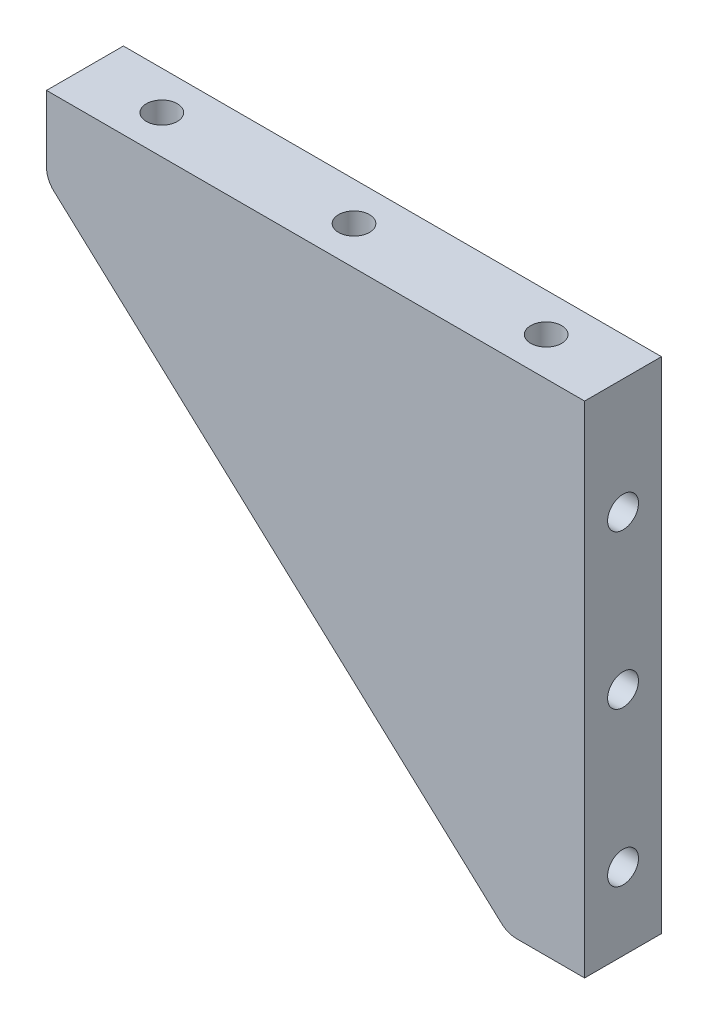
ISO-10303-21;
HEADER;
FILE_DESCRIPTION(('STEP AP214'),'2;1');
FILE_NAME('part.step','',(''),(''),'','','');
FILE_SCHEMA(('AUTOMOTIVE_DESIGN { 1 0 10303 214 1 1 1 1 }'));
ENDSEC;
DATA;
#1=APPLICATION_CONTEXT('core data for automotive mechanical design processes');
#2=APPLICATION_PROTOCOL_DEFINITION('international standard','automotive_design',2000,#1);
#3=PRODUCT_CONTEXT('',#1,'mechanical');
#4=PRODUCT('Part','Part','',(#3));
#5=PRODUCT_RELATED_PRODUCT_CATEGORY('part','',(#4));
#6=PRODUCT_DEFINITION_FORMATION('','',#4);
#7=PRODUCT_DEFINITION_CONTEXT('part definition',#1,'design');
#8=PRODUCT_DEFINITION('design','',#6,#7);
#9=PRODUCT_DEFINITION_SHAPE('','',#8);
#10=(LENGTH_UNIT() NAMED_UNIT(*) SI_UNIT(.MILLI.,.METRE.));
#11=(NAMED_UNIT(*) PLANE_ANGLE_UNIT() SI_UNIT($,.RADIAN.));
#12=(NAMED_UNIT(*) SI_UNIT($,.STERADIAN.) SOLID_ANGLE_UNIT());
#13=UNCERTAINTY_MEASURE_WITH_UNIT(LENGTH_MEASURE(1.E-05),#10,'distance_accuracy_value','');
#14=(GEOMETRIC_REPRESENTATION_CONTEXT(3) GLOBAL_UNCERTAINTY_ASSIGNED_CONTEXT((#13)) GLOBAL_UNIT_ASSIGNED_CONTEXT((#10,
#11,#12)) REPRESENTATION_CONTEXT('',''));
#15=CARTESIAN_POINT('',(0.,0.,0.));
#16=DIRECTION('',(0.,0.,1.));
#17=DIRECTION('',(1.,0.,0.));
#18=AXIS2_PLACEMENT_3D('',#15,#16,#17);
#19=CARTESIAN_POINT('',(0.,-82.55,6.35));
#20=DIRECTION('',(-1.,0.,0.));
#21=DIRECTION('',(0.,0.,1.));
#22=AXIS2_PLACEMENT_3D('',#19,#20,#21);
#23=PLANE('',#22);
#24=CARTESIAN_POINT('',(0.,-19.05,0.));
#25=DIRECTION('',(1.,0.,0.));
#26=DIRECTION('',(0.,0.,-1.));
#27=AXIS2_PLACEMENT_3D('',#24,#25,#26);
#28=CIRCLE('',#27,2.55269999999999);
#29=CARTESIAN_POINT('',(0.,-19.05,-2.55269999999999));
#30=VERTEX_POINT('',#29);
#31=EDGE_CURVE('E130',#30,#30,#28,.T.);
#32=ORIENTED_EDGE('',*,*,#31,.F.);
#33=EDGE_LOOP('',(#32));
#34=FACE_BOUND('',#33,.T.);
#35=CARTESIAN_POINT('',(0.,-44.45,0.));
#36=DIRECTION('',(1.,0.,0.));
#37=DIRECTION('',(0.,0.,-1.));
#38=AXIS2_PLACEMENT_3D('',#35,#36,#37);
#39=CIRCLE('',#38,2.55269999999999);
#40=CARTESIAN_POINT('',(0.,-44.45,-2.55269999999999));
#41=VERTEX_POINT('',#40);
#42=EDGE_CURVE('E129',#41,#41,#39,.T.);
#43=ORIENTED_EDGE('',*,*,#42,.F.);
#44=EDGE_LOOP('',(#43));
#45=FACE_BOUND('',#44,.T.);
#46=CARTESIAN_POINT('',(0.,-69.85,0.));
#47=DIRECTION('',(1.,0.,0.));
#48=DIRECTION('',(0.,0.,-1.));
#49=AXIS2_PLACEMENT_3D('',#46,#47,#48);
#50=CIRCLE('',#49,2.55269999999999);
#51=CARTESIAN_POINT('',(0.,-69.85,-2.55269999999999));
#52=VERTEX_POINT('',#51);
#53=EDGE_CURVE('E140',#52,#52,#50,.T.);
#54=ORIENTED_EDGE('',*,*,#53,.F.);
#55=EDGE_LOOP('',(#54));
#56=FACE_BOUND('',#55,.T.);
#57=DIRECTION('',(0.,1.,0.));
#58=VECTOR('',#57,1.);
#59=CARTESIAN_POINT('',(0.,-82.55,-6.35));
#60=LINE('',#59,#58);
#61=CARTESIAN_POINT('',(0.,-82.55,-6.35));
#62=VERTEX_POINT('',#61);
#63=CARTESIAN_POINT('',(0.,0.,-6.35));
#64=VERTEX_POINT('',#63);
#65=EDGE_CURVE('E164',#62,#64,#60,.T.);
#66=ORIENTED_EDGE('',*,*,#65,.T.);
#67=DIRECTION('',(0.,0.,-1.));
#68=VECTOR('',#67,1.);
#69=CARTESIAN_POINT('',(0.,0.,6.35));
#70=LINE('',#69,#68);
#71=CARTESIAN_POINT('',(0.,0.,6.35));
#72=VERTEX_POINT('',#71);
#73=EDGE_CURVE('E193',#72,#64,#70,.T.);
#74=ORIENTED_EDGE('',*,*,#73,.F.);
#75=DIRECTION('',(0.,1.,0.));
#76=VECTOR('',#75,1.);
#77=CARTESIAN_POINT('',(0.,-82.55,6.35));
#78=LINE('',#77,#76);
#79=CARTESIAN_POINT('',(0.,-82.55,6.35));
#80=VERTEX_POINT('',#79);
#81=EDGE_CURVE('E165',#80,#72,#78,.T.);
#82=ORIENTED_EDGE('',*,*,#81,.F.);
#83=DIRECTION('',(0.,0.,-1.));
#84=VECTOR('',#83,1.);
#85=CARTESIAN_POINT('',(0.,-82.55,6.35));
#86=LINE('',#85,#84);
#87=EDGE_CURVE('E177',#80,#62,#86,.T.);
#88=ORIENTED_EDGE('',*,*,#87,.T.);
#89=EDGE_LOOP('',(#66,#74,#82,#88));
#90=FACE_BOUND('',#89,.T.);
#91=ADVANCED_FACE('F41',(#34,#45,#56,#90),#23,.F.);
#92=CARTESIAN_POINT('',(0.,0.,6.35));
#93=DIRECTION('',(0.,-1.,0.));
#94=DIRECTION('',(1.,0.,0.));
#95=AXIS2_PLACEMENT_3D('',#92,#93,#94);
#96=PLANE('',#95);
#97=CARTESIAN_POINT('',(-12.7,0.,0.));
#98=DIRECTION('',(0.,1.,0.));
#99=DIRECTION('',(0.,0.,1.));
#100=AXIS2_PLACEMENT_3D('',#97,#98,#99);
#101=CIRCLE('',#100,2.5527);
#102=CARTESIAN_POINT('',(-12.7,0.,2.5527));
#103=VERTEX_POINT('',#102);
#104=EDGE_CURVE('E146',#103,#103,#101,.T.);
#105=ORIENTED_EDGE('',*,*,#104,.F.);
#106=EDGE_LOOP('',(#105));
#107=FACE_BOUND('',#106,.T.);
#108=CARTESIAN_POINT('',(-44.45,0.,0.));
#109=DIRECTION('',(0.,1.,0.));
#110=DIRECTION('',(0.,0.,1.));
#111=AXIS2_PLACEMENT_3D('',#108,#109,#110);
#112=CIRCLE('',#111,2.5527);
#113=CARTESIAN_POINT('',(-44.45,0.,2.5527));
#114=VERTEX_POINT('',#113);
#115=EDGE_CURVE('E152',#114,#114,#112,.T.);
#116=ORIENTED_EDGE('',*,*,#115,.F.);
#117=EDGE_LOOP('',(#116));
#118=FACE_BOUND('',#117,.T.);
#119=CARTESIAN_POINT('',(-76.2,0.,0.));
#120=DIRECTION('',(0.,1.,0.));
#121=DIRECTION('',(0.,0.,1.));
#122=AXIS2_PLACEMENT_3D('',#119,#120,#121);
#123=CIRCLE('',#122,2.55270000000001);
#124=CARTESIAN_POINT('',(-76.2,0.,2.55270000000001));
#125=VERTEX_POINT('',#124);
#126=EDGE_CURVE('E158',#125,#125,#123,.T.);
#127=ORIENTED_EDGE('',*,*,#126,.F.);
#128=EDGE_LOOP('',(#127));
#129=FACE_BOUND('',#128,.T.);
#130=DIRECTION('',(-1.,0.,0.));
#131=VECTOR('',#130,1.);
#132=CARTESIAN_POINT('',(0.,0.,-6.35));
#133=LINE('',#132,#131);
#134=CARTESIAN_POINT('',(-88.9,0.,-6.35));
#135=VERTEX_POINT('',#134);
#136=EDGE_CURVE('E180',#64,#135,#133,.T.);
#137=ORIENTED_EDGE('',*,*,#136,.T.);
#138=DIRECTION('',(0.,0.,-1.));
#139=VECTOR('',#138,1.);
#140=CARTESIAN_POINT('',(-88.9,0.,6.35));
#141=LINE('',#140,#139);
#142=CARTESIAN_POINT('',(-88.9,0.,6.35));
#143=VERTEX_POINT('',#142);
#144=EDGE_CURVE('E190',#143,#135,#141,.T.);
#145=ORIENTED_EDGE('',*,*,#144,.F.);
#146=DIRECTION('',(-1.,0.,0.));
#147=VECTOR('',#146,1.);
#148=CARTESIAN_POINT('',(0.,0.,6.35));
#149=LINE('',#148,#147);
#150=EDGE_CURVE('E168',#72,#143,#149,.T.);
#151=ORIENTED_EDGE('',*,*,#150,.F.);
#152=ORIENTED_EDGE('',*,*,#73,.T.);
#153=EDGE_LOOP('',(#137,#145,#151,#152));
#154=FACE_BOUND('',#153,.T.);
#155=ADVANCED_FACE('F222',(#107,#118,#129,#154),#96,.F.);
#156=CARTESIAN_POINT('',(-88.9,0.,6.35));
#157=DIRECTION('',(1.,0.,0.));
#158=DIRECTION('',(0.,0.,-1.));
#159=AXIS2_PLACEMENT_3D('',#156,#157,#158);
#160=PLANE('',#159);
#161=DIRECTION('',(0.,-1.,0.));
#162=VECTOR('',#161,1.);
#163=CARTESIAN_POINT('',(-88.9,0.,-6.35));
#164=LINE('',#163,#162);
#165=CARTESIAN_POINT('',(-88.9,-11.0239744607384,-6.35));
#166=VERTEX_POINT('',#165);
#167=EDGE_CURVE('E182',#135,#166,#164,.T.);
#168=ORIENTED_EDGE('',*,*,#167,.T.);
#169=DIRECTION('',(0.,0.,-1.));
#170=VECTOR('',#169,1.);
#171=CARTESIAN_POINT('',(-88.9,-11.0239744607384,6.35));
#172=LINE('',#171,#170);
#173=CARTESIAN_POINT('',(-88.9,-11.0239744607384,6.35));
#174=VERTEX_POINT('',#173);
#175=EDGE_CURVE('E64',#166,#174,#172,.F.);
#176=ORIENTED_EDGE('',*,*,#175,.T.);
#177=DIRECTION('',(0.,-1.,0.));
#178=VECTOR('',#177,1.);
#179=CARTESIAN_POINT('',(-88.9,0.,6.35));
#180=LINE('',#179,#178);
#181=EDGE_CURVE('E171',#143,#174,#180,.T.);
#182=ORIENTED_EDGE('',*,*,#181,.F.);
#183=ORIENTED_EDGE('',*,*,#144,.T.);
#184=EDGE_LOOP('',(#168,#176,#182,#183));
#185=FACE_BOUND('',#184,.T.);
#186=ADVANCED_FACE('F219',(#185),#160,.F.);
#187=CARTESIAN_POINT('',(-88.9,-12.7,6.35));
#188=DIRECTION('',(0.675724628517346,0.737154140200741,0.));
#189=DIRECTION('',(-0.737154140200741,0.675724628517346,0.));
#190=AXIS2_PLACEMENT_3D('',#187,#188,#189);
#191=PLANE('',#190);
#192=DIRECTION('',(0.737154140200741,-0.675724628517346,0.));
#193=VECTOR('',#192,1.);
#194=CARTESIAN_POINT('',(-88.9,-12.7,6.35));
#195=LINE('',#194,#193);
#196=CARTESIAN_POINT('',(-87.6645108346511,-13.8325317349032,6.35));
#197=VERTEX_POINT('',#196);
#198=CARTESIAN_POINT('',(-13.7924829736384,-81.5485572741648,6.35));
#199=VERTEX_POINT('',#198);
#200=EDGE_CURVE('E173',#197,#199,#195,.T.);
#201=ORIENTED_EDGE('',*,*,#200,.F.);
#202=DIRECTION('',(0.,0.,-1.));
#203=VECTOR('',#202,1.);
#204=CARTESIAN_POINT('',(-87.6645108346511,-13.8325317349032,6.35));
#205=LINE('',#204,#203);
#206=CARTESIAN_POINT('',(-87.6645108346511,-13.8325317349032,-6.35));
#207=VERTEX_POINT('',#206);
#208=EDGE_CURVE('E198',#197,#207,#205,.T.);
#209=ORIENTED_EDGE('',*,*,#208,.T.);
#210=DIRECTION('',(0.737154140200741,-0.675724628517346,0.));
#211=VECTOR('',#210,1.);
#212=CARTESIAN_POINT('',(-88.9,-12.7,-6.35));
#213=LINE('',#212,#211);
#214=CARTESIAN_POINT('',(-13.7924829736384,-81.5485572741648,-6.35));
#215=VERTEX_POINT('',#214);
#216=EDGE_CURVE('E184',#207,#215,#213,.T.);
#217=ORIENTED_EDGE('',*,*,#216,.T.);
#218=DIRECTION('',(0.,0.,-1.));
#219=VECTOR('',#218,1.);
#220=CARTESIAN_POINT('',(-13.7924829736384,-81.5485572741648,6.35));
#221=LINE('',#220,#219);
#222=EDGE_CURVE('E196',#215,#199,#221,.F.);
#223=ORIENTED_EDGE('',*,*,#222,.T.);
#224=EDGE_LOOP('',(#201,#209,#217,#223));
#225=FACE_BOUND('',#224,.T.);
#226=ADVANCED_FACE('F212',(#225),#191,.F.);
#227=CARTESIAN_POINT('',(-12.7,-82.55,6.35));
#228=DIRECTION('',(0.,1.,0.));
#229=DIRECTION('',(0.,0.,1.));
#230=AXIS2_PLACEMENT_3D('',#227,#228,#229);
#231=PLANE('',#230);
#232=DIRECTION('',(1.,0.,0.));
#233=VECTOR('',#232,1.);
#234=CARTESIAN_POINT('',(-12.7,-82.55,6.35));
#235=LINE('',#234,#233);
#236=CARTESIAN_POINT('',(-11.2179721389873,-82.55,6.35));
#237=VERTEX_POINT('',#236);
#238=EDGE_CURVE('E175',#237,#80,#235,.T.);
#239=ORIENTED_EDGE('',*,*,#238,.F.);
#240=DIRECTION('',(0.,0.,-1.));
#241=VECTOR('',#240,1.);
#242=CARTESIAN_POINT('',(-11.2179721389873,-82.55,6.35));
#243=LINE('',#242,#241);
#244=CARTESIAN_POINT('',(-11.2179721389873,-82.55,-6.35));
#245=VERTEX_POINT('',#244);
#246=EDGE_CURVE('E11',#237,#245,#243,.T.);
#247=ORIENTED_EDGE('',*,*,#246,.T.);
#248=DIRECTION('',(1.,0.,0.));
#249=VECTOR('',#248,1.);
#250=CARTESIAN_POINT('',(-12.7,-82.55,-6.35));
#251=LINE('',#250,#249);
#252=EDGE_CURVE('E169',#245,#62,#251,.T.);
#253=ORIENTED_EDGE('',*,*,#252,.T.);
#254=ORIENTED_EDGE('',*,*,#87,.F.);
#255=EDGE_LOOP('',(#239,#247,#253,#254));
#256=FACE_BOUND('',#255,.T.);
#257=ADVANCED_FACE('F230',(#256),#231,.F.);
#258=CARTESIAN_POINT('',(0.,0.,6.35));
#259=DIRECTION('',(0.,0.,1.));
#260=DIRECTION('',(1.,0.,0.));
#261=AXIS2_PLACEMENT_3D('',#258,#259,#260);
#262=PLANE('',#261);
#263=ORIENTED_EDGE('',*,*,#181,.T.);
#264=CARTESIAN_POINT('',(-85.09,-11.0239744607384,6.35));
#265=DIRECTION('',(0.,0.,1.));
#266=DIRECTION('',(1.,0.,0.));
#267=AXIS2_PLACEMENT_3D('',#264,#265,#266);
#268=CIRCLE('',#267,3.81);
#269=EDGE_CURVE('E49',#174,#197,#268,.T.);
#270=ORIENTED_EDGE('',*,*,#269,.T.);
#271=ORIENTED_EDGE('',*,*,#200,.T.);
#272=CARTESIAN_POINT('',(-11.2179721389873,-78.74,6.35));
#273=DIRECTION('',(0.,0.,1.));
#274=DIRECTION('',(1.,0.,0.));
#275=AXIS2_PLACEMENT_3D('',#272,#273,#274);
#276=CIRCLE('',#275,3.81);
#277=EDGE_CURVE('E56',#199,#237,#276,.T.);
#278=ORIENTED_EDGE('',*,*,#277,.T.);
#279=ORIENTED_EDGE('',*,*,#238,.T.);
#280=ORIENTED_EDGE('',*,*,#81,.T.);
#281=ORIENTED_EDGE('',*,*,#150,.T.);
#282=EDGE_LOOP('',(#263,#270,#271,#278,#279,#280,#281));
#283=FACE_BOUND('',#282,.T.);
#284=ADVANCED_FACE('F208',(#283),#262,.T.);
#285=CARTESIAN_POINT('',(0.,0.,-6.35));
#286=DIRECTION('',(0.,0.,1.));
#287=DIRECTION('',(1.,0.,0.));
#288=AXIS2_PLACEMENT_3D('',#285,#286,#287);
#289=PLANE('',#288);
#290=ORIENTED_EDGE('',*,*,#216,.F.);
#291=CARTESIAN_POINT('',(-85.09,-11.0239744607384,-6.35));
#292=DIRECTION('',(0.,0.,1.));
#293=DIRECTION('',(1.,0.,0.));
#294=AXIS2_PLACEMENT_3D('',#291,#292,#293);
#295=CIRCLE('',#294,3.81);
#296=EDGE_CURVE('E203',#207,#166,#295,.F.);
#297=ORIENTED_EDGE('',*,*,#296,.T.);
#298=ORIENTED_EDGE('',*,*,#167,.F.);
#299=ORIENTED_EDGE('',*,*,#136,.F.);
#300=ORIENTED_EDGE('',*,*,#65,.F.);
#301=ORIENTED_EDGE('',*,*,#252,.F.);
#302=CARTESIAN_POINT('',(-11.2179721389873,-78.74,-6.35));
#303=DIRECTION('',(0.,0.,1.));
#304=DIRECTION('',(1.,0.,0.));
#305=AXIS2_PLACEMENT_3D('',#302,#303,#304);
#306=CIRCLE('',#305,3.81);
#307=EDGE_CURVE('E201',#245,#215,#306,.F.);
#308=ORIENTED_EDGE('',*,*,#307,.T.);
#309=EDGE_LOOP('',(#290,#297,#298,#299,#300,#301,#308));
#310=FACE_BOUND('',#309,.T.);
#311=ADVANCED_FACE('F218',(#310),#289,.F.);
#312=CARTESIAN_POINT('',(-76.2,-12.7,0.));
#313=DIRECTION('',(0.,1.,0.));
#314=DIRECTION('',(0.,0.,1.));
#315=AXIS2_PLACEMENT_3D('',#312,#313,#314);
#316=CONICAL_SURFACE('',#315,2.55269999999999,1.02974425867665);
#317=CARTESIAN_POINT('',(-76.2,-14.2338169021917,0.));
#318=VERTEX_POINT('',#317);
#319=VERTEX_LOOP('',#318);
#320=FACE_BOUND('',#319,.T.);
#321=CARTESIAN_POINT('',(-76.2,-12.7,0.));
#322=DIRECTION('',(0.,1.,0.));
#323=DIRECTION('',(0.,0.,1.));
#324=AXIS2_PLACEMENT_3D('',#321,#322,#323);
#325=CIRCLE('',#324,2.55269999999999);
#326=CARTESIAN_POINT('',(-76.2,-12.7,2.55269999999999));
#327=VERTEX_POINT('',#326);
#328=EDGE_CURVE('E161',#327,#327,#325,.T.);
#329=ORIENTED_EDGE('',*,*,#328,.T.);
#330=EDGE_LOOP('',(#329));
#331=FACE_BOUND('',#330,.T.);
#332=ADVANCED_FACE('F258',(#320,#331),#316,.F.);
#333=CARTESIAN_POINT('',(-76.2,0.,0.));
#334=DIRECTION('',(0.,1.,0.));
#335=DIRECTION('',(0.,0.,1.));
#336=AXIS2_PLACEMENT_3D('',#333,#334,#335);
#337=CYLINDRICAL_SURFACE('',#336,2.5527);
#338=ORIENTED_EDGE('',*,*,#328,.F.);
#339=EDGE_LOOP('',(#338));
#340=FACE_BOUND('',#339,.T.);
#341=ORIENTED_EDGE('',*,*,#126,.T.);
#342=EDGE_LOOP('',(#341));
#343=FACE_BOUND('',#342,.T.);
#344=ADVANCED_FACE('F263',(#340,#343),#337,.F.);
#345=CARTESIAN_POINT('',(-44.45,-12.7,0.));
#346=DIRECTION('',(0.,1.,0.));
#347=DIRECTION('',(0.,0.,1.));
#348=AXIS2_PLACEMENT_3D('',#345,#346,#347);
#349=CONICAL_SURFACE('',#348,2.5527,1.02974425867665);
#350=CARTESIAN_POINT('',(-44.45,-14.2338169021917,0.));
#351=VERTEX_POINT('',#350);
#352=VERTEX_LOOP('',#351);
#353=FACE_BOUND('',#352,.T.);
#354=CARTESIAN_POINT('',(-44.45,-12.7,0.));
#355=DIRECTION('',(0.,1.,0.));
#356=DIRECTION('',(0.,0.,1.));
#357=AXIS2_PLACEMENT_3D('',#354,#355,#356);
#358=CIRCLE('',#357,2.5527);
#359=CARTESIAN_POINT('',(-44.45,-12.7,2.5527));
#360=VERTEX_POINT('',#359);
#361=EDGE_CURVE('E155',#360,#360,#358,.T.);
#362=ORIENTED_EDGE('',*,*,#361,.T.);
#363=EDGE_LOOP('',(#362));
#364=FACE_BOUND('',#363,.T.);
#365=ADVANCED_FACE('F267',(#353,#364),#349,.F.);
#366=CARTESIAN_POINT('',(-44.45,0.,0.));
#367=DIRECTION('',(0.,1.,0.));
#368=DIRECTION('',(0.,0.,1.));
#369=AXIS2_PLACEMENT_3D('',#366,#367,#368);
#370=CYLINDRICAL_SURFACE('',#369,2.5527);
#371=ORIENTED_EDGE('',*,*,#361,.F.);
#372=EDGE_LOOP('',(#371));
#373=FACE_BOUND('',#372,.T.);
#374=ORIENTED_EDGE('',*,*,#115,.T.);
#375=EDGE_LOOP('',(#374));
#376=FACE_BOUND('',#375,.T.);
#377=ADVANCED_FACE('F271',(#373,#376),#370,.F.);
#378=CARTESIAN_POINT('',(-12.7,-12.7,0.));
#379=DIRECTION('',(0.,1.,0.));
#380=DIRECTION('',(0.,0.,1.));
#381=AXIS2_PLACEMENT_3D('',#378,#379,#380);
#382=CONICAL_SURFACE('',#381,2.5527,1.02974425867665);
#383=CARTESIAN_POINT('',(-12.7,-14.2338169021917,0.));
#384=VERTEX_POINT('',#383);
#385=VERTEX_LOOP('',#384);
#386=FACE_BOUND('',#385,.T.);
#387=CARTESIAN_POINT('',(-12.7,-12.7,0.));
#388=DIRECTION('',(0.,1.,0.));
#389=DIRECTION('',(0.,0.,1.));
#390=AXIS2_PLACEMENT_3D('',#387,#388,#389);
#391=CIRCLE('',#390,2.5527);
#392=CARTESIAN_POINT('',(-12.7,-12.7,2.5527));
#393=VERTEX_POINT('',#392);
#394=EDGE_CURVE('E149',#393,#393,#391,.T.);
#395=ORIENTED_EDGE('',*,*,#394,.T.);
#396=EDGE_LOOP('',(#395));
#397=FACE_BOUND('',#396,.T.);
#398=ADVANCED_FACE('F275',(#386,#397),#382,.F.);
#399=CARTESIAN_POINT('',(-12.7,0.,0.));
#400=DIRECTION('',(0.,1.,0.));
#401=DIRECTION('',(0.,0.,1.));
#402=AXIS2_PLACEMENT_3D('',#399,#400,#401);
#403=CYLINDRICAL_SURFACE('',#402,2.5527);
#404=ORIENTED_EDGE('',*,*,#394,.F.);
#405=EDGE_LOOP('',(#404));
#406=FACE_BOUND('',#405,.T.);
#407=ORIENTED_EDGE('',*,*,#104,.T.);
#408=EDGE_LOOP('',(#407));
#409=FACE_BOUND('',#408,.T.);
#410=ADVANCED_FACE('F279',(#406,#409),#403,.F.);
#411=CARTESIAN_POINT('',(-12.7,-69.85,0.));
#412=DIRECTION('',(1.,0.,0.));
#413=DIRECTION('',(0.,0.,-1.));
#414=AXIS2_PLACEMENT_3D('',#411,#412,#413);
#415=CONICAL_SURFACE('',#414,2.55269999999999,1.02974425867665);
#416=CARTESIAN_POINT('',(-14.2338169021917,-69.85,0.));
#417=VERTEX_POINT('',#416);
#418=VERTEX_LOOP('',#417);
#419=FACE_BOUND('',#418,.T.);
#420=CARTESIAN_POINT('',(-12.7,-69.85,0.));
#421=DIRECTION('',(1.,0.,0.));
#422=DIRECTION('',(0.,0.,-1.));
#423=AXIS2_PLACEMENT_3D('',#420,#421,#422);
#424=CIRCLE('',#423,2.55269999999999);
#425=CARTESIAN_POINT('',(-12.7,-69.85,-2.55269999999999));
#426=VERTEX_POINT('',#425);
#427=EDGE_CURVE('E143',#426,#426,#424,.T.);
#428=ORIENTED_EDGE('',*,*,#427,.T.);
#429=EDGE_LOOP('',(#428));
#430=FACE_BOUND('',#429,.T.);
#431=ADVANCED_FACE('F283',(#419,#430),#415,.F.);
#432=CARTESIAN_POINT('',(0.,-69.85,0.));
#433=DIRECTION('',(1.,0.,0.));
#434=DIRECTION('',(0.,0.,-1.));
#435=AXIS2_PLACEMENT_3D('',#432,#433,#434);
#436=CYLINDRICAL_SURFACE('',#435,2.55269999999999);
#437=ORIENTED_EDGE('',*,*,#427,.F.);
#438=EDGE_LOOP('',(#437));
#439=FACE_BOUND('',#438,.T.);
#440=ORIENTED_EDGE('',*,*,#53,.T.);
#441=EDGE_LOOP('',(#440));
#442=FACE_BOUND('',#441,.T.);
#443=ADVANCED_FACE('F287',(#439,#442),#436,.F.);
#444=CARTESIAN_POINT('',(-12.7,-44.45,0.));
#445=DIRECTION('',(1.,0.,0.));
#446=DIRECTION('',(0.,0.,-1.));
#447=AXIS2_PLACEMENT_3D('',#444,#445,#446);
#448=CONICAL_SURFACE('',#447,2.55269999999998,1.02974425867665);
#449=CARTESIAN_POINT('',(-14.2338169021917,-44.45,0.));
#450=VERTEX_POINT('',#449);
#451=VERTEX_LOOP('',#450);
#452=FACE_BOUND('',#451,.T.);
#453=CARTESIAN_POINT('',(-12.7,-44.45,0.));
#454=DIRECTION('',(1.,0.,0.));
#455=DIRECTION('',(0.,0.,-1.));
#456=AXIS2_PLACEMENT_3D('',#453,#454,#455);
#457=CIRCLE('',#456,2.55269999999998);
#458=CARTESIAN_POINT('',(-12.7,-44.45,-2.55269999999998));
#459=VERTEX_POINT('',#458);
#460=EDGE_CURVE('E133',#459,#459,#457,.T.);
#461=ORIENTED_EDGE('',*,*,#460,.T.);
#462=EDGE_LOOP('',(#461));
#463=FACE_BOUND('',#462,.T.);
#464=ADVANCED_FACE('F290',(#452,#463),#448,.F.);
#465=CARTESIAN_POINT('',(0.,-44.45,0.));
#466=DIRECTION('',(1.,0.,0.));
#467=DIRECTION('',(0.,0.,-1.));
#468=AXIS2_PLACEMENT_3D('',#465,#466,#467);
#469=CYLINDRICAL_SURFACE('',#468,2.55269999999999);
#470=ORIENTED_EDGE('',*,*,#460,.F.);
#471=EDGE_LOOP('',(#470));
#472=FACE_BOUND('',#471,.T.);
#473=ORIENTED_EDGE('',*,*,#42,.T.);
#474=EDGE_LOOP('',(#473));
#475=FACE_BOUND('',#474,.T.);
#476=ADVANCED_FACE('F123',(#472,#475),#469,.F.);
#477=CARTESIAN_POINT('',(-12.7,-19.05,0.));
#478=DIRECTION('',(1.,0.,0.));
#479=DIRECTION('',(0.,0.,-1.));
#480=AXIS2_PLACEMENT_3D('',#477,#478,#479);
#481=CONICAL_SURFACE('',#480,2.55269999999999,1.02974425867665);
#482=CARTESIAN_POINT('',(-14.2338169021917,-19.05,0.));
#483=VERTEX_POINT('',#482);
#484=VERTEX_LOOP('',#483);
#485=FACE_BOUND('',#484,.T.);
#486=CARTESIAN_POINT('',(-12.7,-19.05,0.));
#487=DIRECTION('',(1.,0.,0.));
#488=DIRECTION('',(0.,0.,-1.));
#489=AXIS2_PLACEMENT_3D('',#486,#487,#488);
#490=CIRCLE('',#489,2.55269999999999);
#491=CARTESIAN_POINT('',(-12.7,-19.05,-2.55269999999999));
#492=VERTEX_POINT('',#491);
#493=EDGE_CURVE('E127',#492,#492,#490,.T.);
#494=ORIENTED_EDGE('',*,*,#493,.T.);
#495=EDGE_LOOP('',(#494));
#496=FACE_BOUND('',#495,.T.);
#497=ADVANCED_FACE('F119',(#485,#496),#481,.F.);
#498=CARTESIAN_POINT('',(0.,-19.05,0.));
#499=DIRECTION('',(1.,0.,0.));
#500=DIRECTION('',(0.,0.,-1.));
#501=AXIS2_PLACEMENT_3D('',#498,#499,#500);
#502=CYLINDRICAL_SURFACE('',#501,2.55269999999999);
#503=ORIENTED_EDGE('',*,*,#493,.F.);
#504=EDGE_LOOP('',(#503));
#505=FACE_BOUND('',#504,.T.);
#506=ORIENTED_EDGE('',*,*,#31,.T.);
#507=EDGE_LOOP('',(#506));
#508=FACE_BOUND('',#507,.T.);
#509=ADVANCED_FACE('F122',(#505,#508),#502,.F.);
#510=CARTESIAN_POINT('',(-85.09,-11.0239744607384,6.35));
#511=DIRECTION('',(0.,0.,-1.));
#512=DIRECTION('',(-1.,0.,0.));
#513=AXIS2_PLACEMENT_3D('',#510,#511,#512);
#514=CYLINDRICAL_SURFACE('',#513,3.81);
#515=ORIENTED_EDGE('',*,*,#269,.F.);
#516=ORIENTED_EDGE('',*,*,#175,.F.);
#517=ORIENTED_EDGE('',*,*,#296,.F.);
#518=ORIENTED_EDGE('',*,*,#208,.F.);
#519=EDGE_LOOP('',(#515,#516,#517,#518));
#520=FACE_BOUND('',#519,.T.);
#521=ADVANCED_FACE('F215',(#520),#514,.T.);
#522=CARTESIAN_POINT('',(-11.2179721389873,-78.74,6.35));
#523=DIRECTION('',(0.,0.,-1.));
#524=DIRECTION('',(-1.,0.,0.));
#525=AXIS2_PLACEMENT_3D('',#522,#523,#524);
#526=CYLINDRICAL_SURFACE('',#525,3.81);
#527=ORIENTED_EDGE('',*,*,#277,.F.);
#528=ORIENTED_EDGE('',*,*,#222,.F.);
#529=ORIENTED_EDGE('',*,*,#307,.F.);
#530=ORIENTED_EDGE('',*,*,#246,.F.);
#531=EDGE_LOOP('',(#527,#528,#529,#530));
#532=FACE_BOUND('',#531,.T.);
#533=ADVANCED_FACE('F43',(#532),#526,.T.);
#534=CLOSED_SHELL('',(#91,#155,#186,#226,#257,#284,#311,#332,#344,#365,#377,#398,#410,#431,#443,
#464,#476,#497,#509,#521,#533));
#535=MANIFOLD_SOLID_BREP('B2',#534);
#536=ADVANCED_BREP_SHAPE_REPRESENTATION('',(#18,#535),#14);
#537=SHAPE_DEFINITION_REPRESENTATION(#9,#536);
ENDSEC;
END-ISO-10303-21;
